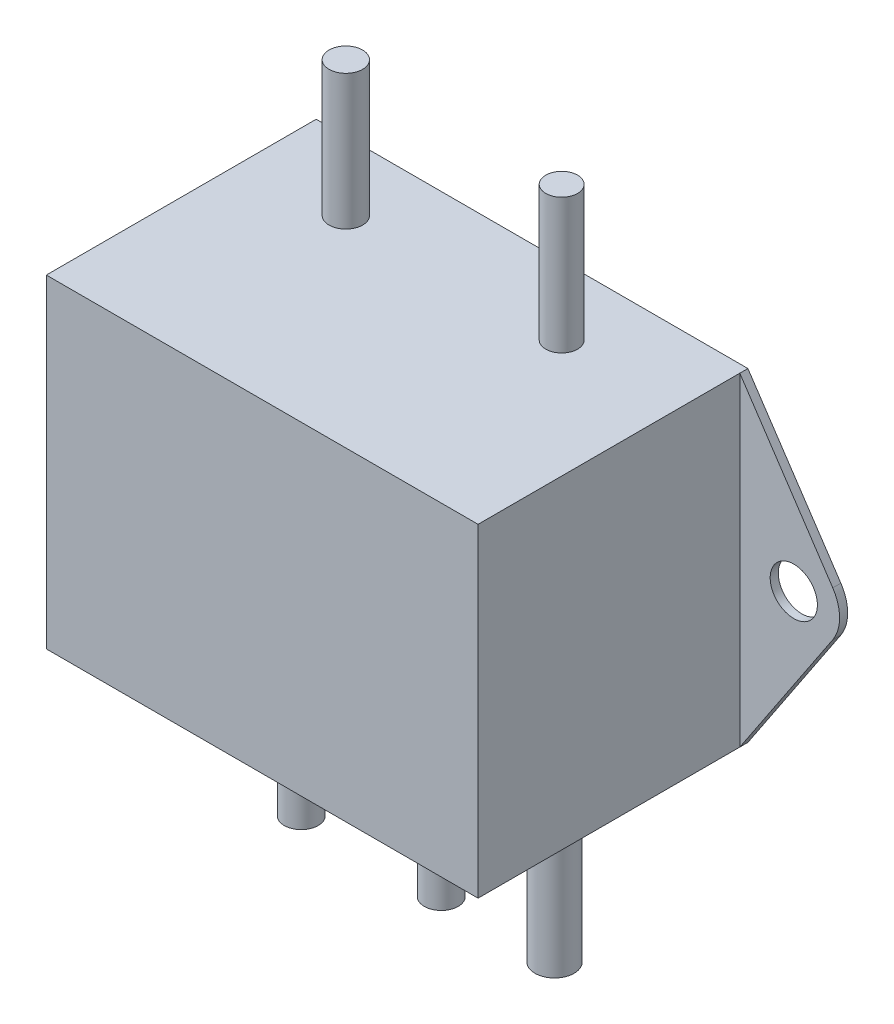
ISO-10303-21;
HEADER;
FILE_DESCRIPTION(('STEP AP214'),'2;1');
FILE_NAME('part.step','',(''),(''),'','','');
FILE_SCHEMA(('AUTOMOTIVE_DESIGN { 1 0 10303 214 1 1 1 1 }'));
ENDSEC;
DATA;
#1=APPLICATION_CONTEXT('core data for automotive mechanical design processes');
#2=APPLICATION_PROTOCOL_DEFINITION('international standard','automotive_design',2000,#1);
#3=PRODUCT_CONTEXT('',#1,'mechanical');
#4=PRODUCT('Part','Part','',(#3));
#5=PRODUCT_RELATED_PRODUCT_CATEGORY('part','',(#4));
#6=PRODUCT_DEFINITION_FORMATION('','',#4);
#7=PRODUCT_DEFINITION_CONTEXT('part definition',#1,'design');
#8=PRODUCT_DEFINITION('design','',#6,#7);
#9=PRODUCT_DEFINITION_SHAPE('','',#8);
#10=(LENGTH_UNIT() NAMED_UNIT(*) SI_UNIT(.MILLI.,.METRE.));
#11=(NAMED_UNIT(*) PLANE_ANGLE_UNIT() SI_UNIT($,.RADIAN.));
#12=(NAMED_UNIT(*) SI_UNIT($,.STERADIAN.) SOLID_ANGLE_UNIT());
#13=UNCERTAINTY_MEASURE_WITH_UNIT(LENGTH_MEASURE(1.E-05),#10,'distance_accuracy_value','');
#14=(GEOMETRIC_REPRESENTATION_CONTEXT(3) GLOBAL_UNCERTAINTY_ASSIGNED_CONTEXT((#13)) GLOBAL_UNIT_ASSIGNED_CONTEXT((#10,
#11,#12)) REPRESENTATION_CONTEXT('',''));
#15=CARTESIAN_POINT('',(0.,0.,0.));
#16=DIRECTION('',(0.,0.,1.));
#17=DIRECTION('',(1.,0.,0.));
#18=AXIS2_PLACEMENT_3D('',#15,#16,#17);
#19=CARTESIAN_POINT('',(-16.,-12.,20.));
#20=DIRECTION('',(0.,1.,0.));
#21=DIRECTION('',(0.,0.,1.));
#22=AXIS2_PLACEMENT_3D('',#19,#20,#21);
#23=PLANE('',#22);
#24=CARTESIAN_POINT('',(-0.462719157217788,-12.,6.26519537388512));
#25=DIRECTION('',(0.,1.,0.));
#26=DIRECTION('',(0.,0.,1.));
#27=AXIS2_PLACEMENT_3D('',#24,#25,#26);
#28=CIRCLE('',#27,1.25595199816257);
#29=CARTESIAN_POINT('',(-0.462719157217788,-12.,7.52114737204769));
#30=VERTEX_POINT('',#29);
#31=EDGE_CURVE('E40',#30,#30,#28,.F.);
#32=ORIENTED_EDGE('',*,*,#31,.F.);
#33=EDGE_LOOP('',(#32));
#34=FACE_BOUND('',#33,.T.);
#35=DIRECTION('',(1.,0.,0.));
#36=VECTOR('',#35,1.);
#37=CARTESIAN_POINT('',(-16.,-12.,0.));
#38=LINE('',#37,#36);
#39=CARTESIAN_POINT('',(-16.,-12.,0.));
#40=VERTEX_POINT('',#39);
#41=CARTESIAN_POINT('',(16.,-12.,0.));
#42=VERTEX_POINT('',#41);
#43=EDGE_CURVE('E129',#40,#42,#38,.T.);
#44=ORIENTED_EDGE('',*,*,#43,.T.);
#45=DIRECTION('',(0.,0.,-1.));
#46=VECTOR('',#45,1.);
#47=CARTESIAN_POINT('',(16.,-12.,0.6));
#48=LINE('',#47,#46);
#49=CARTESIAN_POINT('',(16.,-12.,0.6));
#50=VERTEX_POINT('',#49);
#51=EDGE_CURVE('E125',#50,#42,#48,.T.);
#52=ORIENTED_EDGE('',*,*,#51,.F.);
#53=DIRECTION('',(0.,0.,-1.));
#54=VECTOR('',#53,1.);
#55=CARTESIAN_POINT('',(16.,-12.,20.));
#56=LINE('',#55,#54);
#57=CARTESIAN_POINT('',(16.,-12.,20.));
#58=VERTEX_POINT('',#57);
#59=EDGE_CURVE('E112',#58,#50,#56,.T.);
#60=ORIENTED_EDGE('',*,*,#59,.F.);
#61=DIRECTION('',(1.,0.,0.));
#62=VECTOR('',#61,1.);
#63=CARTESIAN_POINT('',(-16.,-12.,20.));
#64=LINE('',#63,#62);
#65=CARTESIAN_POINT('',(-16.,-12.,20.));
#66=VERTEX_POINT('',#65);
#67=EDGE_CURVE('E219',#66,#58,#64,.T.);
#68=ORIENTED_EDGE('',*,*,#67,.F.);
#69=DIRECTION('',(0.,0.,-1.));
#70=VECTOR('',#69,1.);
#71=CARTESIAN_POINT('',(-16.,-12.,20.));
#72=LINE('',#71,#70);
#73=CARTESIAN_POINT('',(-16.,-12.,0.6));
#74=VERTEX_POINT('',#73);
#75=EDGE_CURVE('E121',#66,#74,#72,.T.);
#76=ORIENTED_EDGE('',*,*,#75,.T.);
#77=DIRECTION('',(0.,0.,-1.));
#78=VECTOR('',#77,1.);
#79=CARTESIAN_POINT('',(-16.,-12.,0.6));
#80=LINE('',#79,#78);
#81=EDGE_CURVE('E176',#74,#40,#80,.T.);
#82=ORIENTED_EDGE('',*,*,#81,.T.);
#83=EDGE_LOOP('',(#44,#52,#60,#68,#76,#82));
#84=FACE_BOUND('',#83,.T.);
#85=CARTESIAN_POINT('',(-10.8408488262453,-12.,6.26519537388512));
#86=DIRECTION('',(0.,1.,0.));
#87=DIRECTION('',(0.,0.,1.));
#88=AXIS2_PLACEMENT_3D('',#85,#86,#87);
#89=CIRCLE('',#88,1.25595199816257);
#90=CARTESIAN_POINT('',(-10.8408488262453,-12.,7.52114737204769));
#91=VERTEX_POINT('',#90);
#92=EDGE_CURVE('E540',#91,#91,#89,.F.);
#93=ORIENTED_EDGE('',*,*,#92,.F.);
#94=EDGE_LOOP('',(#93));
#95=FACE_BOUND('',#94,.T.);
#96=CARTESIAN_POINT('',(7.9323284094478,-12.,6.26519537388512));
#97=DIRECTION('',(0.,1.,0.));
#98=DIRECTION('',(0.,0.,1.));
#99=AXIS2_PLACEMENT_3D('',#96,#97,#98);
#100=CIRCLE('',#99,1.44974619789683);
#101=CARTESIAN_POINT('',(7.9323284094478,-12.,7.71494157178195));
#102=VERTEX_POINT('',#101);
#103=EDGE_CURVE('E11',#102,#102,#100,.F.);
#104=ORIENTED_EDGE('',*,*,#103,.F.);
#105=EDGE_LOOP('',(#104));
#106=FACE_BOUND('',#105,.T.);
#107=ADVANCED_FACE('F32',(#34,#84,#95,#106),#23,.F.);
#108=CARTESIAN_POINT('',(-16.,12.,20.));
#109=DIRECTION('',(0.,-1.,0.));
#110=DIRECTION('',(0.,0.,-1.));
#111=AXIS2_PLACEMENT_3D('',#108,#109,#110);
#112=PLANE('',#111);
#113=CARTESIAN_POINT('',(-8.72556125039258,12.,5.07534611246775));
#114=DIRECTION('',(0.,-1.,0.));
#115=DIRECTION('',(0.,0.,-1.));
#116=AXIS2_PLACEMENT_3D('',#113,#114,#115);
#117=CIRCLE('',#116,1.24195766725227);
#118=CARTESIAN_POINT('',(-8.72556125039258,12.,3.83338844521547));
#119=VERTEX_POINT('',#118);
#120=EDGE_CURVE('E547',#119,#119,#117,.F.);
#121=ORIENTED_EDGE('',*,*,#120,.F.);
#122=EDGE_LOOP('',(#121));
#123=FACE_BOUND('',#122,.T.);
#124=DIRECTION('',(-1.,0.,0.));
#125=VECTOR('',#124,1.);
#126=CARTESIAN_POINT('',(-16.,12.,0.));
#127=LINE('',#126,#125);
#128=CARTESIAN_POINT('',(16.,12.,0.));
#129=VERTEX_POINT('',#128);
#130=CARTESIAN_POINT('',(-16.,12.,0.));
#131=VERTEX_POINT('',#130);
#132=EDGE_CURVE('E220',#129,#131,#127,.T.);
#133=ORIENTED_EDGE('',*,*,#132,.T.);
#134=DIRECTION('',(0.,0.,-1.));
#135=VECTOR('',#134,1.);
#136=CARTESIAN_POINT('',(-16.,12.,0.6));
#137=LINE('',#136,#135);
#138=CARTESIAN_POINT('',(-16.,12.,0.6));
#139=VERTEX_POINT('',#138);
#140=EDGE_CURVE('E185',#139,#131,#137,.T.);
#141=ORIENTED_EDGE('',*,*,#140,.F.);
#142=DIRECTION('',(0.,0.,-1.));
#143=VECTOR('',#142,1.);
#144=CARTESIAN_POINT('',(-16.,12.,20.));
#145=LINE('',#144,#143);
#146=CARTESIAN_POINT('',(-16.,12.,20.));
#147=VERTEX_POINT('',#146);
#148=EDGE_CURVE('E189',#147,#139,#145,.T.);
#149=ORIENTED_EDGE('',*,*,#148,.F.);
#150=DIRECTION('',(-1.,0.,0.));
#151=VECTOR('',#150,1.);
#152=CARTESIAN_POINT('',(-16.,12.,20.));
#153=LINE('',#152,#151);
#154=CARTESIAN_POINT('',(16.,12.,20.));
#155=VERTEX_POINT('',#154);
#156=EDGE_CURVE('E202',#155,#147,#153,.T.);
#157=ORIENTED_EDGE('',*,*,#156,.F.);
#158=DIRECTION('',(0.,0.,-1.));
#159=VECTOR('',#158,1.);
#160=CARTESIAN_POINT('',(16.,12.,20.));
#161=LINE('',#160,#159);
#162=CARTESIAN_POINT('',(16.,12.,0.6));
#163=VERTEX_POINT('',#162);
#164=EDGE_CURVE('E122',#155,#163,#161,.T.);
#165=ORIENTED_EDGE('',*,*,#164,.T.);
#166=DIRECTION('',(0.,0.,-1.));
#167=VECTOR('',#166,1.);
#168=CARTESIAN_POINT('',(16.,12.,0.6));
#169=LINE('',#168,#167);
#170=EDGE_CURVE('E134',#163,#129,#169,.T.);
#171=ORIENTED_EDGE('',*,*,#170,.T.);
#172=EDGE_LOOP('',(#133,#141,#149,#157,#165,#171));
#173=FACE_BOUND('',#172,.T.);
#174=CARTESIAN_POINT('',(7.27130104199381,12.,5.07534611246775));
#175=DIRECTION('',(0.,-1.,0.));
#176=DIRECTION('',(0.,0.,-1.));
#177=AXIS2_PLACEMENT_3D('',#174,#175,#176);
#178=CIRCLE('',#177,1.17692576752248);
#179=CARTESIAN_POINT('',(7.27130104199381,12.,3.89842034494527));
#180=VERTEX_POINT('',#179);
#181=EDGE_CURVE('E542',#180,#180,#178,.F.);
#182=ORIENTED_EDGE('',*,*,#181,.F.);
#183=EDGE_LOOP('',(#182));
#184=FACE_BOUND('',#183,.T.);
#185=ADVANCED_FACE('F229',(#123,#173,#184),#112,.F.);
#186=CARTESIAN_POINT('',(16.,12.,20.));
#187=DIRECTION('',(-1.,0.,0.));
#188=DIRECTION('',(0.,0.,1.));
#189=AXIS2_PLACEMENT_3D('',#186,#187,#188);
#190=PLANE('',#189);
#191=DIRECTION('',(0.,-1.,0.));
#192=VECTOR('',#191,1.);
#193=CARTESIAN_POINT('',(16.,-12.,0.6));
#194=LINE('',#193,#192);
#195=EDGE_CURVE('E117',#163,#50,#194,.T.);
#196=ORIENTED_EDGE('',*,*,#195,.F.);
#197=ORIENTED_EDGE('',*,*,#164,.F.);
#198=DIRECTION('',(0.,1.,0.));
#199=VECTOR('',#198,1.);
#200=CARTESIAN_POINT('',(16.,12.,20.));
#201=LINE('',#200,#199);
#202=EDGE_CURVE('E119',#58,#155,#201,.T.);
#203=ORIENTED_EDGE('',*,*,#202,.F.);
#204=ORIENTED_EDGE('',*,*,#59,.T.);
#205=EDGE_LOOP('',(#196,#197,#203,#204));
#206=FACE_BOUND('',#205,.T.);
#207=ADVANCED_FACE('F114',(#206),#190,.F.);
#208=CARTESIAN_POINT('',(-16.,12.,20.));
#209=DIRECTION('',(1.,0.,0.));
#210=DIRECTION('',(0.,0.,-1.));
#211=AXIS2_PLACEMENT_3D('',#208,#209,#210);
#212=PLANE('',#211);
#213=DIRECTION('',(0.,1.,0.));
#214=VECTOR('',#213,1.);
#215=CARTESIAN_POINT('',(-16.,-12.,0.6));
#216=LINE('',#215,#214);
#217=EDGE_CURVE('E204',#74,#139,#216,.T.);
#218=ORIENTED_EDGE('',*,*,#217,.F.);
#219=ORIENTED_EDGE('',*,*,#75,.F.);
#220=DIRECTION('',(0.,-1.,0.));
#221=VECTOR('',#220,1.);
#222=CARTESIAN_POINT('',(-16.,12.,20.));
#223=LINE('',#222,#221);
#224=EDGE_CURVE('E216',#147,#66,#223,.T.);
#225=ORIENTED_EDGE('',*,*,#224,.F.);
#226=ORIENTED_EDGE('',*,*,#148,.T.);
#227=EDGE_LOOP('',(#218,#219,#225,#226));
#228=FACE_BOUND('',#227,.T.);
#229=ADVANCED_FACE('F243',(#228),#212,.F.);
#230=CARTESIAN_POINT('',(-16.,-12.,20.));
#231=DIRECTION('',(0.,0.,1.));
#232=DIRECTION('',(1.,0.,0.));
#233=AXIS2_PLACEMENT_3D('',#230,#231,#232);
#234=PLANE('',#233);
#235=ORIENTED_EDGE('',*,*,#224,.T.);
#236=ORIENTED_EDGE('',*,*,#67,.T.);
#237=ORIENTED_EDGE('',*,*,#202,.T.);
#238=ORIENTED_EDGE('',*,*,#156,.T.);
#239=EDGE_LOOP('',(#235,#236,#237,#238));
#240=FACE_BOUND('',#239,.T.);
#241=ADVANCED_FACE('F302',(#240),#234,.T.);
#242=CARTESIAN_POINT('',(-16.,-12.,0.));
#243=DIRECTION('',(0.,0.,1.));
#244=DIRECTION('',(1.,0.,0.));
#245=AXIS2_PLACEMENT_3D('',#242,#243,#244);
#246=PLANE('',#245);
#247=CARTESIAN_POINT('',(20.,0.,0.));
#248=DIRECTION('',(0.,0.,1.));
#249=DIRECTION('',(1.,0.,0.));
#250=AXIS2_PLACEMENT_3D('',#247,#248,#249);
#251=CIRCLE('',#250,1.75);
#252=CARTESIAN_POINT('',(21.75,0.,0.));
#253=VERTEX_POINT('',#252);
#254=EDGE_CURVE('E259',#253,#253,#251,.T.);
#255=ORIENTED_EDGE('',*,*,#254,.T.);
#256=EDGE_LOOP('',(#255));
#257=FACE_BOUND('',#256,.T.);
#258=CARTESIAN_POINT('',(-20.,0.,0.));
#259=DIRECTION('',(0.,0.,1.));
#260=DIRECTION('',(1.,0.,0.));
#261=AXIS2_PLACEMENT_3D('',#258,#259,#260);
#262=CIRCLE('',#261,1.75);
#263=CARTESIAN_POINT('',(-18.25,0.,0.));
#264=VERTEX_POINT('',#263);
#265=EDGE_CURVE('E250',#264,#264,#262,.T.);
#266=ORIENTED_EDGE('',*,*,#265,.T.);
#267=EDGE_LOOP('',(#266));
#268=FACE_BOUND('',#267,.T.);
#269=DIRECTION('',(-0.554700196225229,0.832050294337844,0.));
#270=VECTOR('',#269,1.);
#271=CARTESIAN_POINT('',(16.,12.,0.));
#272=LINE('',#271,#270);
#273=CARTESIAN_POINT('',(22.8905996075495,1.66410058867569,0.));
#274=VERTEX_POINT('',#273);
#275=EDGE_CURVE('E147',#274,#129,#272,.T.);
#276=ORIENTED_EDGE('',*,*,#275,.F.);
#277=CARTESIAN_POINT('',(20.394448724536,0.,0.));
#278=DIRECTION('',(0.,0.,1.));
#279=DIRECTION('',(1.,0.,0.));
#280=AXIS2_PLACEMENT_3D('',#277,#278,#279);
#281=CIRCLE('',#280,3.);
#282=CARTESIAN_POINT('',(22.8905996075495,-1.66410058867569,0.));
#283=VERTEX_POINT('',#282);
#284=EDGE_CURVE('E167',#274,#283,#281,.F.);
#285=ORIENTED_EDGE('',*,*,#284,.T.);
#286=DIRECTION('',(0.554700196225229,0.832050294337844,0.));
#287=VECTOR('',#286,1.);
#288=CARTESIAN_POINT('',(24.,0.,0.));
#289=LINE('',#288,#287);
#290=EDGE_CURVE('E150',#42,#283,#289,.T.);
#291=ORIENTED_EDGE('',*,*,#290,.F.);
#292=ORIENTED_EDGE('',*,*,#43,.F.);
#293=DIRECTION('',(0.554700196225229,-0.832050294337844,0.));
#294=VECTOR('',#293,1.);
#295=CARTESIAN_POINT('',(-24.,0.,0.));
#296=LINE('',#295,#294);
#297=CARTESIAN_POINT('',(-22.8905996075495,-1.66410058867569,0.));
#298=VERTEX_POINT('',#297);
#299=EDGE_CURVE('E209',#298,#40,#296,.T.);
#300=ORIENTED_EDGE('',*,*,#299,.F.);
#301=CARTESIAN_POINT('',(-20.394448724536,0.,0.));
#302=DIRECTION('',(0.,0.,1.));
#303=DIRECTION('',(1.,0.,0.));
#304=AXIS2_PLACEMENT_3D('',#301,#302,#303);
#305=CIRCLE('',#304,3.);
#306=CARTESIAN_POINT('',(-22.8905996075495,1.66410058867569,0.));
#307=VERTEX_POINT('',#306);
#308=EDGE_CURVE('E165',#298,#307,#305,.F.);
#309=ORIENTED_EDGE('',*,*,#308,.T.);
#310=DIRECTION('',(-0.554700196225229,-0.832050294337844,0.));
#311=VECTOR('',#310,1.);
#312=CARTESIAN_POINT('',(-16.,12.,0.));
#313=LINE('',#312,#311);
#314=EDGE_CURVE('E213',#131,#307,#313,.T.);
#315=ORIENTED_EDGE('',*,*,#314,.F.);
#316=ORIENTED_EDGE('',*,*,#132,.F.);
#317=EDGE_LOOP('',(#276,#285,#291,#292,#300,#309,#315,#316));
#318=FACE_BOUND('',#317,.T.);
#319=ADVANCED_FACE('F236',(#257,#268,#318),#246,.F.);
#320=CARTESIAN_POINT('',(-16.,12.,0.6));
#321=DIRECTION('',(0.832050294337844,-0.554700196225229,0.));
#322=DIRECTION('',(0.554700196225229,0.832050294337844,0.));
#323=AXIS2_PLACEMENT_3D('',#320,#321,#322);
#324=PLANE('',#323);
#325=ORIENTED_EDGE('',*,*,#314,.T.);
#326=DIRECTION('',(0.,0.,-1.));
#327=VECTOR('',#326,1.);
#328=CARTESIAN_POINT('',(-22.8905996075495,1.66410058867569,0.6));
#329=LINE('',#328,#327);
#330=CARTESIAN_POINT('',(-22.8905996075495,1.66410058867569,0.6));
#331=VERTEX_POINT('',#330);
#332=EDGE_CURVE('E47',#307,#331,#329,.F.);
#333=ORIENTED_EDGE('',*,*,#332,.T.);
#334=DIRECTION('',(-0.554700196225229,-0.832050294337844,0.));
#335=VECTOR('',#334,1.);
#336=CARTESIAN_POINT('',(-16.,12.,0.6));
#337=LINE('',#336,#335);
#338=EDGE_CURVE('E177',#139,#331,#337,.T.);
#339=ORIENTED_EDGE('',*,*,#338,.F.);
#340=ORIENTED_EDGE('',*,*,#140,.T.);
#341=EDGE_LOOP('',(#325,#333,#339,#340));
#342=FACE_BOUND('',#341,.T.);
#343=ADVANCED_FACE('F238',(#342),#324,.F.);
#344=CARTESIAN_POINT('',(-24.,0.,0.6));
#345=DIRECTION('',(0.832050294337844,0.554700196225229,0.));
#346=DIRECTION('',(-0.554700196225229,0.832050294337844,0.));
#347=AXIS2_PLACEMENT_3D('',#344,#345,#346);
#348=PLANE('',#347);
#349=DIRECTION('',(0.554700196225229,-0.832050294337844,0.));
#350=VECTOR('',#349,1.);
#351=CARTESIAN_POINT('',(-24.,0.,0.6));
#352=LINE('',#351,#350);
#353=CARTESIAN_POINT('',(-22.8905996075495,-1.66410058867569,0.6));
#354=VERTEX_POINT('',#353);
#355=EDGE_CURVE('E173',#354,#74,#352,.T.);
#356=ORIENTED_EDGE('',*,*,#355,.F.);
#357=DIRECTION('',(0.,0.,-1.));
#358=VECTOR('',#357,1.);
#359=CARTESIAN_POINT('',(-22.8905996075495,-1.66410058867569,0.6));
#360=LINE('',#359,#358);
#361=EDGE_CURVE('E172',#354,#298,#360,.T.);
#362=ORIENTED_EDGE('',*,*,#361,.T.);
#363=ORIENTED_EDGE('',*,*,#299,.T.);
#364=ORIENTED_EDGE('',*,*,#81,.F.);
#365=EDGE_LOOP('',(#356,#362,#363,#364));
#366=FACE_BOUND('',#365,.T.);
#367=ADVANCED_FACE('F247',(#366),#348,.F.);
#368=CARTESIAN_POINT('',(-16.,12.,0.6));
#369=DIRECTION('',(0.,0.,1.));
#370=DIRECTION('',(1.,0.,0.));
#371=AXIS2_PLACEMENT_3D('',#368,#369,#370);
#372=PLANE('',#371);
#373=CARTESIAN_POINT('',(-20.,0.,0.6));
#374=DIRECTION('',(0.,0.,1.));
#375=DIRECTION('',(1.,0.,0.));
#376=AXIS2_PLACEMENT_3D('',#373,#374,#375);
#377=CIRCLE('',#376,1.75);
#378=CARTESIAN_POINT('',(-18.25,0.,0.6));
#379=VERTEX_POINT('',#378);
#380=EDGE_CURVE('E252',#379,#379,#377,.T.);
#381=ORIENTED_EDGE('',*,*,#380,.F.);
#382=EDGE_LOOP('',(#381));
#383=FACE_BOUND('',#382,.T.);
#384=ORIENTED_EDGE('',*,*,#338,.T.);
#385=CARTESIAN_POINT('',(-20.394448724536,0.,0.6));
#386=DIRECTION('',(0.,0.,1.));
#387=DIRECTION('',(1.,0.,0.));
#388=AXIS2_PLACEMENT_3D('',#385,#386,#387);
#389=CIRCLE('',#388,3.);
#390=EDGE_CURVE('E54',#331,#354,#389,.T.);
#391=ORIENTED_EDGE('',*,*,#390,.T.);
#392=ORIENTED_EDGE('',*,*,#355,.T.);
#393=ORIENTED_EDGE('',*,*,#217,.T.);
#394=EDGE_LOOP('',(#384,#391,#392,#393));
#395=FACE_BOUND('',#394,.T.);
#396=ADVANCED_FACE('F240',(#383,#395),#372,.T.);
#397=CARTESIAN_POINT('',(24.,0.,0.6));
#398=DIRECTION('',(-0.832050294337844,0.554700196225229,0.));
#399=DIRECTION('',(-0.554700196225229,-0.832050294337844,0.));
#400=AXIS2_PLACEMENT_3D('',#397,#398,#399);
#401=PLANE('',#400);
#402=ORIENTED_EDGE('',*,*,#290,.T.);
#403=DIRECTION('',(0.,0.,-1.));
#404=VECTOR('',#403,1.);
#405=CARTESIAN_POINT('',(22.8905996075495,-1.66410058867569,0.6));
#406=LINE('',#405,#404);
#407=CARTESIAN_POINT('',(22.8905996075495,-1.66410058867569,0.6));
#408=VERTEX_POINT('',#407);
#409=EDGE_CURVE('E146',#283,#408,#406,.F.);
#410=ORIENTED_EDGE('',*,*,#409,.T.);
#411=DIRECTION('',(0.554700196225229,0.832050294337844,0.));
#412=VECTOR('',#411,1.);
#413=CARTESIAN_POINT('',(24.,0.,0.6));
#414=LINE('',#413,#412);
#415=EDGE_CURVE('E139',#50,#408,#414,.T.);
#416=ORIENTED_EDGE('',*,*,#415,.F.);
#417=ORIENTED_EDGE('',*,*,#51,.T.);
#418=EDGE_LOOP('',(#402,#410,#416,#417));
#419=FACE_BOUND('',#418,.T.);
#420=ADVANCED_FACE('F144',(#419),#401,.F.);
#421=CARTESIAN_POINT('',(16.,12.,0.6));
#422=DIRECTION('',(-0.832050294337844,-0.554700196225229,0.));
#423=DIRECTION('',(0.554700196225229,-0.832050294337844,0.));
#424=AXIS2_PLACEMENT_3D('',#421,#422,#423);
#425=PLANE('',#424);
#426=DIRECTION('',(-0.554700196225229,0.832050294337844,0.));
#427=VECTOR('',#426,1.);
#428=CARTESIAN_POINT('',(16.,12.,0.6));
#429=LINE('',#428,#427);
#430=CARTESIAN_POINT('',(22.8905996075495,1.66410058867569,0.6));
#431=VERTEX_POINT('',#430);
#432=EDGE_CURVE('E142',#431,#163,#429,.T.);
#433=ORIENTED_EDGE('',*,*,#432,.F.);
#434=DIRECTION('',(0.,0.,-1.));
#435=VECTOR('',#434,1.);
#436=CARTESIAN_POINT('',(22.8905996075495,1.66410058867569,0.6));
#437=LINE('',#436,#435);
#438=EDGE_CURVE('E162',#431,#274,#437,.T.);
#439=ORIENTED_EDGE('',*,*,#438,.T.);
#440=ORIENTED_EDGE('',*,*,#275,.T.);
#441=ORIENTED_EDGE('',*,*,#170,.F.);
#442=EDGE_LOOP('',(#433,#439,#440,#441));
#443=FACE_BOUND('',#442,.T.);
#444=ADVANCED_FACE('F318',(#443),#425,.F.);
#445=CARTESIAN_POINT('',(24.,0.,0.6));
#446=DIRECTION('',(0.,0.,1.));
#447=DIRECTION('',(1.,0.,0.));
#448=AXIS2_PLACEMENT_3D('',#445,#446,#447);
#449=PLANE('',#448);
#450=CARTESIAN_POINT('',(20.,0.,0.6));
#451=DIRECTION('',(0.,0.,1.));
#452=DIRECTION('',(-1.,0.,0.));
#453=AXIS2_PLACEMENT_3D('',#450,#451,#452);
#454=CIRCLE('',#453,1.75);
#455=CARTESIAN_POINT('',(18.25,0.,0.6));
#456=VERTEX_POINT('',#455);
#457=EDGE_CURVE('E262',#456,#456,#454,.T.);
#458=ORIENTED_EDGE('',*,*,#457,.F.);
#459=EDGE_LOOP('',(#458));
#460=FACE_BOUND('',#459,.T.);
#461=ORIENTED_EDGE('',*,*,#415,.T.);
#462=CARTESIAN_POINT('',(20.394448724536,0.,0.6));
#463=DIRECTION('',(0.,0.,1.));
#464=DIRECTION('',(1.,0.,0.));
#465=AXIS2_PLACEMENT_3D('',#462,#463,#464);
#466=CIRCLE('',#465,3.);
#467=EDGE_CURVE('E170',#408,#431,#466,.T.);
#468=ORIENTED_EDGE('',*,*,#467,.T.);
#469=ORIENTED_EDGE('',*,*,#432,.T.);
#470=ORIENTED_EDGE('',*,*,#195,.T.);
#471=EDGE_LOOP('',(#461,#468,#469,#470));
#472=FACE_BOUND('',#471,.T.);
#473=ADVANCED_FACE('F138',(#460,#472),#449,.T.);
#474=CARTESIAN_POINT('',(-20.,0.,-2.499999999996E-05));
#475=DIRECTION('',(0.,0.,1.));
#476=DIRECTION('',(1.,0.,0.));
#477=AXIS2_PLACEMENT_3D('',#474,#475,#476);
#478=CYLINDRICAL_SURFACE('',#477,1.75);
#479=ORIENTED_EDGE('',*,*,#380,.T.);
#480=EDGE_LOOP('',(#479));
#481=FACE_BOUND('',#480,.T.);
#482=ORIENTED_EDGE('',*,*,#265,.F.);
#483=EDGE_LOOP('',(#482));
#484=FACE_BOUND('',#483,.T.);
#485=ADVANCED_FACE('F313',(#481,#484),#478,.F.);
#486=CARTESIAN_POINT('',(20.,0.,-2.499999999996E-05));
#487=DIRECTION('',(0.,0.,1.));
#488=DIRECTION('',(1.,0.,0.));
#489=AXIS2_PLACEMENT_3D('',#486,#487,#488);
#490=CYLINDRICAL_SURFACE('',#489,1.75);
#491=ORIENTED_EDGE('',*,*,#457,.T.);
#492=EDGE_LOOP('',(#491));
#493=FACE_BOUND('',#492,.T.);
#494=ORIENTED_EDGE('',*,*,#254,.F.);
#495=EDGE_LOOP('',(#494));
#496=FACE_BOUND('',#495,.T.);
#497=ADVANCED_FACE('F305',(#493,#496),#490,.F.);
#498=CARTESIAN_POINT('',(20.394448724536,0.,0.6));
#499=DIRECTION('',(0.,0.,-1.));
#500=DIRECTION('',(-1.,0.,0.));
#501=AXIS2_PLACEMENT_3D('',#498,#499,#500);
#502=CYLINDRICAL_SURFACE('',#501,3.);
#503=ORIENTED_EDGE('',*,*,#467,.F.);
#504=ORIENTED_EDGE('',*,*,#409,.F.);
#505=ORIENTED_EDGE('',*,*,#284,.F.);
#506=ORIENTED_EDGE('',*,*,#438,.F.);
#507=EDGE_LOOP('',(#503,#504,#505,#506));
#508=FACE_BOUND('',#507,.T.);
#509=ADVANCED_FACE('F303',(#508),#502,.T.);
#510=CARTESIAN_POINT('',(-20.394448724536,0.,0.6));
#511=DIRECTION('',(0.,0.,-1.));
#512=DIRECTION('',(-1.,0.,0.));
#513=AXIS2_PLACEMENT_3D('',#510,#511,#512);
#514=CYLINDRICAL_SURFACE('',#513,3.);
#515=ORIENTED_EDGE('',*,*,#390,.F.);
#516=ORIENTED_EDGE('',*,*,#332,.F.);
#517=ORIENTED_EDGE('',*,*,#308,.F.);
#518=ORIENTED_EDGE('',*,*,#361,.F.);
#519=EDGE_LOOP('',(#515,#516,#517,#518));
#520=FACE_BOUND('',#519,.T.);
#521=ADVANCED_FACE('F34',(#520),#514,.T.);
#522=CARTESIAN_POINT('',(-8.72556125039258,22.,5.07534611246775));
#523=DIRECTION('',(0.,-1.,0.));
#524=DIRECTION('',(0.,0.,-1.));
#525=AXIS2_PLACEMENT_3D('',#522,#523,#524);
#526=CYLINDRICAL_SURFACE('',#525,1.24195766725227);
#527=CARTESIAN_POINT('',(-8.72556125039258,22.,5.07534611246775));
#528=DIRECTION('',(0.,1.,0.));
#529=DIRECTION('',(0.,0.,1.));
#530=AXIS2_PLACEMENT_3D('',#527,#528,#529);
#531=CIRCLE('',#530,1.24195766725227);
#532=CARTESIAN_POINT('',(-8.72556125039258,22.,6.31730377972002));
#533=VERTEX_POINT('',#532);
#534=EDGE_CURVE('E265',#533,#533,#531,.T.);
#535=ORIENTED_EDGE('',*,*,#534,.F.);
#536=EDGE_LOOP('',(#535));
#537=FACE_BOUND('',#536,.T.);
#538=ORIENTED_EDGE('',*,*,#120,.T.);
#539=EDGE_LOOP('',(#538));
#540=FACE_BOUND('',#539,.T.);
#541=ADVANCED_FACE('F311',(#537,#540),#526,.T.);
#542=CARTESIAN_POINT('',(-8.72556125039258,22.,5.07534611246775));
#543=DIRECTION('',(0.,1.,0.));
#544=DIRECTION('',(0.,0.,1.));
#545=AXIS2_PLACEMENT_3D('',#542,#543,#544);
#546=PLANE('',#545);
#547=ORIENTED_EDGE('',*,*,#534,.T.);
#548=EDGE_LOOP('',(#547));
#549=FACE_BOUND('',#548,.T.);
#550=ADVANCED_FACE('F355',(#549),#546,.T.);
#551=CARTESIAN_POINT('',(7.27130104199381,22.,5.07534611246775));
#552=DIRECTION('',(0.,-1.,0.));
#553=DIRECTION('',(0.,0.,-1.));
#554=AXIS2_PLACEMENT_3D('',#551,#552,#553);
#555=CYLINDRICAL_SURFACE('',#554,1.17692576752248);
#556=CARTESIAN_POINT('',(7.27130104199381,22.,5.07534611246775));
#557=DIRECTION('',(0.,1.,0.));
#558=DIRECTION('',(0.,0.,1.));
#559=AXIS2_PLACEMENT_3D('',#556,#557,#558);
#560=CIRCLE('',#559,1.17692576752248);
#561=CARTESIAN_POINT('',(7.27130104199381,22.,6.25227187999022));
#562=VERTEX_POINT('',#561);
#563=EDGE_CURVE('E268',#562,#562,#560,.T.);
#564=ORIENTED_EDGE('',*,*,#563,.F.);
#565=EDGE_LOOP('',(#564));
#566=FACE_BOUND('',#565,.T.);
#567=ORIENTED_EDGE('',*,*,#181,.T.);
#568=EDGE_LOOP('',(#567));
#569=FACE_BOUND('',#568,.T.);
#570=ADVANCED_FACE('F359',(#566,#569),#555,.T.);
#571=CARTESIAN_POINT('',(7.27130104199381,22.,5.07534611246775));
#572=DIRECTION('',(0.,1.,0.));
#573=DIRECTION('',(0.,0.,1.));
#574=AXIS2_PLACEMENT_3D('',#571,#572,#573);
#575=PLANE('',#574);
#576=ORIENTED_EDGE('',*,*,#563,.T.);
#577=EDGE_LOOP('',(#576));
#578=FACE_BOUND('',#577,.T.);
#579=ADVANCED_FACE('F363',(#578),#575,.T.);
#580=CARTESIAN_POINT('',(-10.8408488262453,-27.,6.26519537388512));
#581=DIRECTION('',(0.,1.,0.));
#582=DIRECTION('',(0.,0.,1.));
#583=AXIS2_PLACEMENT_3D('',#580,#581,#582);
#584=CYLINDRICAL_SURFACE('',#583,1.25595199816257);
#585=CARTESIAN_POINT('',(-10.8408488262453,-27.,6.26519537388512));
#586=DIRECTION('',(0.,-1.,0.));
#587=DIRECTION('',(0.,0.,-1.));
#588=AXIS2_PLACEMENT_3D('',#585,#586,#587);
#589=CIRCLE('',#588,1.25595199816257);
#590=CARTESIAN_POINT('',(-10.8408488262453,-27.,5.00924337572255));
#591=VERTEX_POINT('',#590);
#592=EDGE_CURVE('E271',#591,#591,#589,.T.);
#593=ORIENTED_EDGE('',*,*,#592,.F.);
#594=EDGE_LOOP('',(#593));
#595=FACE_BOUND('',#594,.T.);
#596=ORIENTED_EDGE('',*,*,#92,.T.);
#597=EDGE_LOOP('',(#596));
#598=FACE_BOUND('',#597,.T.);
#599=ADVANCED_FACE('F367',(#595,#598),#584,.T.);
#600=CARTESIAN_POINT('',(-10.8408488262453,-27.,6.26519537388512));
#601=DIRECTION('',(0.,-1.,0.));
#602=DIRECTION('',(0.,0.,-1.));
#603=AXIS2_PLACEMENT_3D('',#600,#601,#602);
#604=PLANE('',#603);
#605=ORIENTED_EDGE('',*,*,#592,.T.);
#606=EDGE_LOOP('',(#605));
#607=FACE_BOUND('',#606,.T.);
#608=ADVANCED_FACE('F371',(#607),#604,.T.);
#609=CARTESIAN_POINT('',(-0.462719157217788,-27.,6.26519537388512));
#610=DIRECTION('',(0.,1.,0.));
#611=DIRECTION('',(0.,0.,1.));
#612=AXIS2_PLACEMENT_3D('',#609,#610,#611);
#613=CYLINDRICAL_SURFACE('',#612,1.25595199816257);
#614=CARTESIAN_POINT('',(-0.462719157217788,-27.,6.26519537388512));
#615=DIRECTION('',(0.,-1.,0.));
#616=DIRECTION('',(0.,0.,-1.));
#617=AXIS2_PLACEMENT_3D('',#614,#615,#616);
#618=CIRCLE('',#617,1.25595199816257);
#619=CARTESIAN_POINT('',(-0.462719157217788,-27.,5.00924337572255));
#620=VERTEX_POINT('',#619);
#621=EDGE_CURVE('E274',#620,#620,#618,.T.);
#622=ORIENTED_EDGE('',*,*,#621,.F.);
#623=EDGE_LOOP('',(#622));
#624=FACE_BOUND('',#623,.T.);
#625=ORIENTED_EDGE('',*,*,#31,.T.);
#626=EDGE_LOOP('',(#625));
#627=FACE_BOUND('',#626,.T.);
#628=ADVANCED_FACE('F375',(#624,#627),#613,.T.);
#629=CARTESIAN_POINT('',(-0.462719157217788,-27.,6.26519537388512));
#630=DIRECTION('',(0.,-1.,0.));
#631=DIRECTION('',(0.,0.,-1.));
#632=AXIS2_PLACEMENT_3D('',#629,#630,#631);
#633=PLANE('',#632);
#634=ORIENTED_EDGE('',*,*,#621,.T.);
#635=EDGE_LOOP('',(#634));
#636=FACE_BOUND('',#635,.T.);
#637=ADVANCED_FACE('F286',(#636),#633,.T.);
#638=CARTESIAN_POINT('',(7.9323284094478,-27.,6.26519537388512));
#639=DIRECTION('',(0.,1.,0.));
#640=DIRECTION('',(0.,0.,1.));
#641=AXIS2_PLACEMENT_3D('',#638,#639,#640);
#642=CYLINDRICAL_SURFACE('',#641,1.44974619789683);
#643=CARTESIAN_POINT('',(7.9323284094478,-27.,6.26519537388512));
#644=DIRECTION('',(0.,-1.,0.));
#645=DIRECTION('',(0.,0.,-1.));
#646=AXIS2_PLACEMENT_3D('',#643,#644,#645);
#647=CIRCLE('',#646,1.44974619789683);
#648=CARTESIAN_POINT('',(7.9323284094478,-27.,4.81544917598829));
#649=VERTEX_POINT('',#648);
#650=EDGE_CURVE('E277',#649,#649,#647,.T.);
#651=ORIENTED_EDGE('',*,*,#650,.F.);
#652=EDGE_LOOP('',(#651));
#653=FACE_BOUND('',#652,.T.);
#654=ORIENTED_EDGE('',*,*,#103,.T.);
#655=EDGE_LOOP('',(#654));
#656=FACE_BOUND('',#655,.T.);
#657=ADVANCED_FACE('F283',(#653,#656),#642,.T.);
#658=CARTESIAN_POINT('',(7.9323284094478,-27.,6.26519537388512));
#659=DIRECTION('',(0.,-1.,0.));
#660=DIRECTION('',(0.,0.,-1.));
#661=AXIS2_PLACEMENT_3D('',#658,#659,#660);
#662=PLANE('',#661);
#663=ORIENTED_EDGE('',*,*,#650,.T.);
#664=EDGE_LOOP('',(#663));
#665=FACE_BOUND('',#664,.T.);
#666=ADVANCED_FACE('F281',(#665),#662,.T.);
#667=CLOSED_SHELL('',(#107,#185,#207,#229,#241,#319,#343,#367,#396,#420,#444,#473,#485,#497,
#509,#521,#541,#550,#570,#579,#599,#608,#628,#637,#657,#666));
#668=MANIFOLD_SOLID_BREP('B2',#667);
#669=ADVANCED_BREP_SHAPE_REPRESENTATION('',(#18,#668),#14);
#670=SHAPE_DEFINITION_REPRESENTATION(#9,#669);
ENDSEC;
END-ISO-10303-21;
